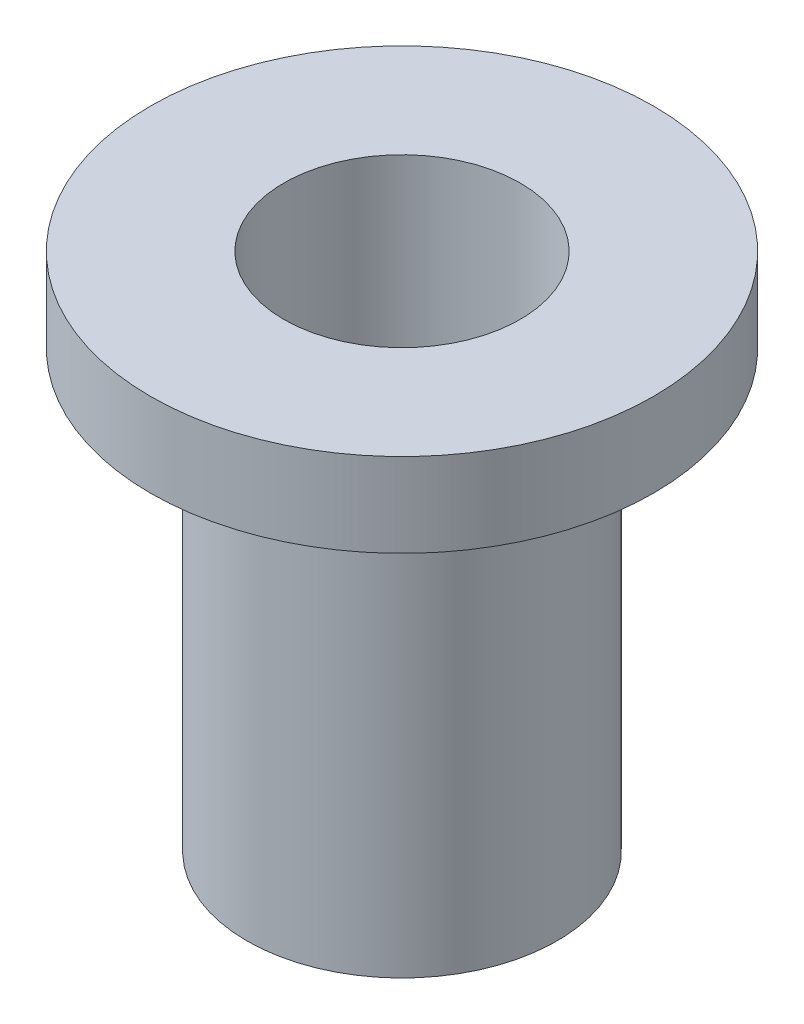
ISO-10303-21;
HEADER;
FILE_DESCRIPTION(('STEP AP214'),'2;1');
FILE_NAME('part.step','',(''),(''),'','','');
FILE_SCHEMA(('AUTOMOTIVE_DESIGN { 1 0 10303 214 1 1 1 1 }'));
ENDSEC;
DATA;
#1=APPLICATION_CONTEXT('core data for automotive mechanical design processes');
#2=APPLICATION_PROTOCOL_DEFINITION('international standard','automotive_design',2000,#1);
#3=PRODUCT_CONTEXT('',#1,'mechanical');
#4=PRODUCT('Part','Part','',(#3));
#5=PRODUCT_RELATED_PRODUCT_CATEGORY('part','',(#4));
#6=PRODUCT_DEFINITION_FORMATION('','',#4);
#7=PRODUCT_DEFINITION_CONTEXT('part definition',#1,'design');
#8=PRODUCT_DEFINITION('design','',#6,#7);
#9=PRODUCT_DEFINITION_SHAPE('','',#8);
#10=(LENGTH_UNIT() NAMED_UNIT(*) SI_UNIT(.MILLI.,.METRE.));
#11=(NAMED_UNIT(*) PLANE_ANGLE_UNIT() SI_UNIT($,.RADIAN.));
#12=(NAMED_UNIT(*) SI_UNIT($,.STERADIAN.) SOLID_ANGLE_UNIT());
#13=UNCERTAINTY_MEASURE_WITH_UNIT(LENGTH_MEASURE(1.E-05),#10,'distance_accuracy_value','');
#14=(GEOMETRIC_REPRESENTATION_CONTEXT(3) GLOBAL_UNCERTAINTY_ASSIGNED_CONTEXT((#13)) GLOBAL_UNIT_ASSIGNED_CONTEXT((#10,
#11,#12)) REPRESENTATION_CONTEXT('',''));
#15=CARTESIAN_POINT('',(0.,0.,0.));
#16=DIRECTION('',(0.,0.,1.));
#17=DIRECTION('',(1.,0.,0.));
#18=AXIS2_PLACEMENT_3D('',#15,#16,#17);
#19=CARTESIAN_POINT('',(0.,0.,0.));
#20=DIRECTION('',(0.,-1.,0.));
#21=DIRECTION('',(0.,0.,-1.));
#22=AXIS2_PLACEMENT_3D('',#19,#20,#21);
#23=CYLINDRICAL_SURFACE('',#22,1.79070000000001);
#24=CARTESIAN_POINT('',(0.,193.96,0.));
#25=DIRECTION('',(0.,-1.,0.));
#26=DIRECTION('',(0.,0.,-1.));
#27=AXIS2_PLACEMENT_3D('',#24,#25,#26);
#28=CIRCLE('',#27,1.79070000000001);
#29=CARTESIAN_POINT('',(0.,193.96,-1.79070000000001));
#30=VERTEX_POINT('',#29);
#31=EDGE_CURVE('E10',#30,#30,#28,.T.);
#32=ORIENTED_EDGE('',*,*,#31,.T.);
#33=EDGE_LOOP('',(#32));
#34=FACE_BOUND('',#33,.T.);
#35=CARTESIAN_POINT('',(0.,201.834,0.));
#36=DIRECTION('',(0.,-1.,0.));
#37=DIRECTION('',(0.,0.,-1.));
#38=AXIS2_PLACEMENT_3D('',#35,#36,#37);
#39=CIRCLE('',#38,1.79070000000001);
#40=CARTESIAN_POINT('',(0.,201.834,-1.79070000000001));
#41=VERTEX_POINT('',#40);
#42=EDGE_CURVE('E52',#41,#41,#39,.T.);
#43=ORIENTED_EDGE('',*,*,#42,.F.);
#44=EDGE_LOOP('',(#43));
#45=FACE_BOUND('',#44,.T.);
#46=ADVANCED_FACE('F30',(#34,#45),#23,.F.);
#47=CARTESIAN_POINT('',(1.79070000000001,193.96,0.));
#48=DIRECTION('',(0.,-1.,0.));
#49=DIRECTION('',(0.,0.,-1.));
#50=AXIS2_PLACEMENT_3D('',#47,#48,#49);
#51=PLANE('',#50);
#52=CARTESIAN_POINT('',(0.,193.96,0.));
#53=DIRECTION('',(0.,-1.,0.));
#54=DIRECTION('',(0.,0.,-1.));
#55=AXIS2_PLACEMENT_3D('',#52,#53,#54);
#56=CIRCLE('',#55,2.3495);
#57=CARTESIAN_POINT('',(0.,193.96,-2.3495));
#58=VERTEX_POINT('',#57);
#59=EDGE_CURVE('E36',#58,#58,#56,.T.);
#60=ORIENTED_EDGE('',*,*,#59,.T.);
#61=EDGE_LOOP('',(#60));
#62=FACE_BOUND('',#61,.T.);
#63=ORIENTED_EDGE('',*,*,#31,.F.);
#64=EDGE_LOOP('',(#63));
#65=FACE_BOUND('',#64,.T.);
#66=ADVANCED_FACE('F60',(#62,#65),#51,.T.);
#67=CARTESIAN_POINT('',(0.,0.,0.));
#68=DIRECTION('',(0.,-1.,0.));
#69=DIRECTION('',(0.,0.,-1.));
#70=AXIS2_PLACEMENT_3D('',#67,#68,#69);
#71=CYLINDRICAL_SURFACE('',#70,2.3495);
#72=CARTESIAN_POINT('',(0.,200.564,0.));
#73=DIRECTION('',(0.,-1.,0.));
#74=DIRECTION('',(0.,0.,-1.));
#75=AXIS2_PLACEMENT_3D('',#72,#73,#74);
#76=CIRCLE('',#75,2.3495);
#77=CARTESIAN_POINT('',(0.,200.564,-2.3495));
#78=VERTEX_POINT('',#77);
#79=EDGE_CURVE('E40',#78,#78,#76,.T.);
#80=ORIENTED_EDGE('',*,*,#79,.T.);
#81=EDGE_LOOP('',(#80));
#82=FACE_BOUND('',#81,.T.);
#83=ORIENTED_EDGE('',*,*,#59,.F.);
#84=EDGE_LOOP('',(#83));
#85=FACE_BOUND('',#84,.T.);
#86=ADVANCED_FACE('F64',(#82,#85),#71,.T.);
#87=CARTESIAN_POINT('',(2.3495,200.564,0.));
#88=DIRECTION('',(0.,-1.,0.));
#89=DIRECTION('',(0.,0.,-1.));
#90=AXIS2_PLACEMENT_3D('',#87,#88,#89);
#91=PLANE('',#90);
#92=CARTESIAN_POINT('',(0.,200.564,0.));
#93=DIRECTION('',(0.,-1.,0.));
#94=DIRECTION('',(0.,0.,-1.));
#95=AXIS2_PLACEMENT_3D('',#92,#93,#94);
#96=CIRCLE('',#95,3.81);
#97=CARTESIAN_POINT('',(0.,200.564,-3.81));
#98=VERTEX_POINT('',#97);
#99=EDGE_CURVE('E44',#98,#98,#96,.T.);
#100=ORIENTED_EDGE('',*,*,#99,.T.);
#101=EDGE_LOOP('',(#100));
#102=FACE_BOUND('',#101,.T.);
#103=ORIENTED_EDGE('',*,*,#79,.F.);
#104=EDGE_LOOP('',(#103));
#105=FACE_BOUND('',#104,.T.);
#106=ADVANCED_FACE('F68',(#102,#105),#91,.T.);
#107=CARTESIAN_POINT('',(0.,0.,0.));
#108=DIRECTION('',(0.,-1.,0.));
#109=DIRECTION('',(0.,0.,-1.));
#110=AXIS2_PLACEMENT_3D('',#107,#108,#109);
#111=CYLINDRICAL_SURFACE('',#110,3.81);
#112=CARTESIAN_POINT('',(0.,201.834,0.));
#113=DIRECTION('',(0.,-1.,0.));
#114=DIRECTION('',(0.,0.,-1.));
#115=AXIS2_PLACEMENT_3D('',#112,#113,#114);
#116=CIRCLE('',#115,3.81);
#117=CARTESIAN_POINT('',(0.,201.834,-3.81));
#118=VERTEX_POINT('',#117);
#119=EDGE_CURVE('E49',#118,#118,#116,.T.);
#120=ORIENTED_EDGE('',*,*,#119,.T.);
#121=EDGE_LOOP('',(#120));
#122=FACE_BOUND('',#121,.T.);
#123=ORIENTED_EDGE('',*,*,#99,.F.);
#124=EDGE_LOOP('',(#123));
#125=FACE_BOUND('',#124,.T.);
#126=ADVANCED_FACE('F75',(#122,#125),#111,.T.);
#127=CARTESIAN_POINT('',(1.79070000000001,201.834,0.));
#128=DIRECTION('',(0.,1.,0.));
#129=DIRECTION('',(0.,0.,1.));
#130=AXIS2_PLACEMENT_3D('',#127,#128,#129);
#131=PLANE('',#130);
#132=ORIENTED_EDGE('',*,*,#42,.T.);
#133=EDGE_LOOP('',(#132));
#134=FACE_BOUND('',#133,.T.);
#135=ORIENTED_EDGE('',*,*,#119,.F.);
#136=EDGE_LOOP('',(#135));
#137=FACE_BOUND('',#136,.T.);
#138=ADVANCED_FACE('F56',(#134,#137),#131,.T.);
#139=CLOSED_SHELL('',(#46,#66,#86,#106,#126,#138));
#140=MANIFOLD_SOLID_BREP('B2',#139);
#141=ADVANCED_BREP_SHAPE_REPRESENTATION('',(#18,#140),#14);
#142=SHAPE_DEFINITION_REPRESENTATION(#9,#141);
ENDSEC;
END-ISO-10303-21;
